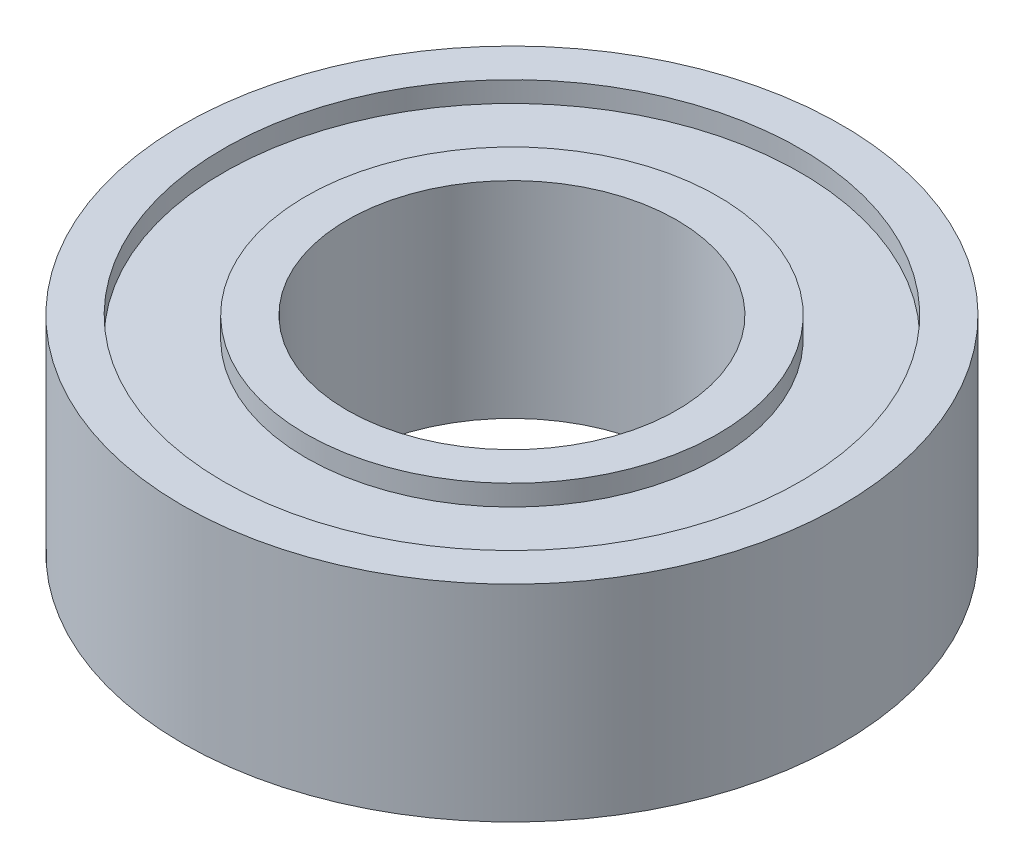
ISO-10303-21;
HEADER;
FILE_DESCRIPTION(('STEP AP214'),'2;1');
FILE_NAME('part.step','',(''),(''),'','','');
FILE_SCHEMA(('AUTOMOTIVE_DESIGN { 1 0 10303 214 1 1 1 1 }'));
ENDSEC;
DATA;
#1=APPLICATION_CONTEXT('core data for automotive mechanical design processes');
#2=APPLICATION_PROTOCOL_DEFINITION('international standard','automotive_design',2000,#1);
#3=PRODUCT_CONTEXT('',#1,'mechanical');
#4=PRODUCT('Part','Part','',(#3));
#5=PRODUCT_RELATED_PRODUCT_CATEGORY('part','',(#4));
#6=PRODUCT_DEFINITION_FORMATION('','',#4);
#7=PRODUCT_DEFINITION_CONTEXT('part definition',#1,'design');
#8=PRODUCT_DEFINITION('design','',#6,#7);
#9=PRODUCT_DEFINITION_SHAPE('','',#8);
#10=(LENGTH_UNIT() NAMED_UNIT(*) SI_UNIT(.MILLI.,.METRE.));
#11=(NAMED_UNIT(*) PLANE_ANGLE_UNIT() SI_UNIT($,.RADIAN.));
#12=(NAMED_UNIT(*) SI_UNIT($,.STERADIAN.) SOLID_ANGLE_UNIT());
#13=UNCERTAINTY_MEASURE_WITH_UNIT(LENGTH_MEASURE(1.E-05),#10,'distance_accuracy_value','');
#14=(GEOMETRIC_REPRESENTATION_CONTEXT(3) GLOBAL_UNCERTAINTY_ASSIGNED_CONTEXT((#13)) GLOBAL_UNIT_ASSIGNED_CONTEXT((#10,
#11,#12)) REPRESENTATION_CONTEXT('',''));
#15=CARTESIAN_POINT('',(0.,0.,0.));
#16=DIRECTION('',(0.,0.,1.));
#17=DIRECTION('',(1.,0.,0.));
#18=AXIS2_PLACEMENT_3D('',#15,#16,#17);
#19=CARTESIAN_POINT('',(0.,5.,0.));
#20=DIRECTION('',(0.,-1.,0.));
#21=DIRECTION('',(0.,0.,-1.));
#22=AXIS2_PLACEMENT_3D('',#19,#20,#21);
#23=CYLINDRICAL_SURFACE('',#22,7.);
#24=CARTESIAN_POINT('',(0.,0.,0.));
#25=DIRECTION('',(0.,1.,0.));
#26=DIRECTION('',(0.,0.,1.));
#27=AXIS2_PLACEMENT_3D('',#24,#25,#26);
#28=CIRCLE('',#27,7.);
#29=CARTESIAN_POINT('',(0.,0.,7.));
#30=VERTEX_POINT('',#29);
#31=EDGE_CURVE('E62',#30,#30,#28,.T.);
#32=ORIENTED_EDGE('',*,*,#31,.F.);
#33=EDGE_LOOP('',(#32));
#34=FACE_BOUND('',#33,.T.);
#35=CARTESIAN_POINT('',(0.,0.5,0.));
#36=DIRECTION('',(0.,1.,0.));
#37=DIRECTION('',(0.,0.,1.));
#38=AXIS2_PLACEMENT_3D('',#35,#36,#37);
#39=CIRCLE('',#38,7.);
#40=CARTESIAN_POINT('',(0.,0.5,7.));
#41=VERTEX_POINT('',#40);
#42=EDGE_CURVE('E95',#41,#41,#39,.T.);
#43=ORIENTED_EDGE('',*,*,#42,.T.);
#44=EDGE_LOOP('',(#43));
#45=FACE_BOUND('',#44,.T.);
#46=ADVANCED_FACE('F42',(#34,#45),#23,.F.);
#47=CARTESIAN_POINT('',(0.,4.5,0.));
#48=DIRECTION('',(0.,1.,0.));
#49=DIRECTION('',(0.,0.,1.));
#50=AXIS2_PLACEMENT_3D('',#47,#48,#49);
#51=CIRCLE('',#50,7.);
#52=CARTESIAN_POINT('',(0.,4.5,7.));
#53=VERTEX_POINT('',#52);
#54=EDGE_CURVE('E11',#53,#53,#51,.T.);
#55=ORIENTED_EDGE('',*,*,#54,.F.);
#56=EDGE_LOOP('',(#55));
#57=FACE_BOUND('',#56,.T.);
#58=CARTESIAN_POINT('',(0.,5.,0.));
#59=DIRECTION('',(0.,1.,0.));
#60=DIRECTION('',(0.,0.,1.));
#61=AXIS2_PLACEMENT_3D('',#58,#59,#60);
#62=CIRCLE('',#61,7.);
#63=CARTESIAN_POINT('',(0.,5.,7.));
#64=VERTEX_POINT('',#63);
#65=EDGE_CURVE('E53',#64,#64,#62,.T.);
#66=ORIENTED_EDGE('',*,*,#65,.T.);
#67=EDGE_LOOP('',(#66));
#68=FACE_BOUND('',#67,.T.);
#69=ADVANCED_FACE('F44',(#57,#68),#23,.F.);
#70=CARTESIAN_POINT('',(0.,5.,0.));
#71=DIRECTION('',(0.,-1.,0.));
#72=DIRECTION('',(0.,0.,-1.));
#73=AXIS2_PLACEMENT_3D('',#70,#71,#72);
#74=CYLINDRICAL_SURFACE('',#73,8.);
#75=CARTESIAN_POINT('',(0.,5.,0.));
#76=DIRECTION('',(0.,1.,0.));
#77=DIRECTION('',(0.,0.,1.));
#78=AXIS2_PLACEMENT_3D('',#75,#76,#77);
#79=CIRCLE('',#78,8.);
#80=CARTESIAN_POINT('',(0.,5.,8.));
#81=VERTEX_POINT('',#80);
#82=EDGE_CURVE('E49',#81,#81,#79,.T.);
#83=ORIENTED_EDGE('',*,*,#82,.F.);
#84=EDGE_LOOP('',(#83));
#85=FACE_BOUND('',#84,.T.);
#86=CARTESIAN_POINT('',(0.,0.,0.));
#87=DIRECTION('',(0.,1.,0.));
#88=DIRECTION('',(0.,0.,1.));
#89=AXIS2_PLACEMENT_3D('',#86,#87,#88);
#90=CIRCLE('',#89,8.);
#91=CARTESIAN_POINT('',(0.,0.,8.));
#92=VERTEX_POINT('',#91);
#93=EDGE_CURVE('E58',#92,#92,#90,.T.);
#94=ORIENTED_EDGE('',*,*,#93,.T.);
#95=EDGE_LOOP('',(#94));
#96=FACE_BOUND('',#95,.T.);
#97=ADVANCED_FACE('F68',(#85,#96),#74,.T.);
#98=CARTESIAN_POINT('',(0.,5.,0.));
#99=DIRECTION('',(0.,1.,0.));
#100=DIRECTION('',(0.,0.,1.));
#101=AXIS2_PLACEMENT_3D('',#98,#99,#100);
#102=PLANE('',#101);
#103=ORIENTED_EDGE('',*,*,#65,.F.);
#104=EDGE_LOOP('',(#103));
#105=FACE_BOUND('',#104,.T.);
#106=ORIENTED_EDGE('',*,*,#82,.T.);
#107=EDGE_LOOP('',(#106));
#108=FACE_BOUND('',#107,.T.);
#109=ADVANCED_FACE('F73',(#105,#108),#102,.T.);
#110=CARTESIAN_POINT('',(0.,0.,0.));
#111=DIRECTION('',(0.,1.,0.));
#112=DIRECTION('',(0.,0.,1.));
#113=AXIS2_PLACEMENT_3D('',#110,#111,#112);
#114=PLANE('',#113);
#115=ORIENTED_EDGE('',*,*,#31,.T.);
#116=EDGE_LOOP('',(#115));
#117=FACE_BOUND('',#116,.T.);
#118=ORIENTED_EDGE('',*,*,#93,.F.);
#119=EDGE_LOOP('',(#118));
#120=FACE_BOUND('',#119,.T.);
#121=ADVANCED_FACE('F70',(#117,#120),#114,.F.);
#122=CARTESIAN_POINT('',(0.,4.5,0.));
#123=DIRECTION('',(0.,1.,0.));
#124=DIRECTION('',(0.,0.,1.));
#125=AXIS2_PLACEMENT_3D('',#122,#123,#124);
#126=PLANE('',#125);
#127=CARTESIAN_POINT('',(0.,4.5,0.));
#128=DIRECTION('',(0.,1.,0.));
#129=DIRECTION('',(0.,0.,1.));
#130=AXIS2_PLACEMENT_3D('',#127,#128,#129);
#131=CIRCLE('',#130,5.);
#132=CARTESIAN_POINT('',(0.,4.5,5.));
#133=VERTEX_POINT('',#132);
#134=EDGE_CURVE('E64',#133,#133,#131,.T.);
#135=ORIENTED_EDGE('',*,*,#134,.F.);
#136=EDGE_LOOP('',(#135));
#137=FACE_BOUND('',#136,.T.);
#138=ORIENTED_EDGE('',*,*,#54,.T.);
#139=EDGE_LOOP('',(#138));
#140=FACE_BOUND('',#139,.T.);
#141=ADVANCED_FACE('F72',(#137,#140),#126,.T.);
#142=CARTESIAN_POINT('',(0.,0.5,0.));
#143=DIRECTION('',(0.,1.,0.));
#144=DIRECTION('',(0.,0.,1.));
#145=AXIS2_PLACEMENT_3D('',#142,#143,#144);
#146=PLANE('',#145);
#147=CARTESIAN_POINT('',(0.,0.5,0.));
#148=DIRECTION('',(0.,1.,0.));
#149=DIRECTION('',(0.,0.,1.));
#150=AXIS2_PLACEMENT_3D('',#147,#148,#149);
#151=CIRCLE('',#150,5.);
#152=CARTESIAN_POINT('',(0.,0.5,5.));
#153=VERTEX_POINT('',#152);
#154=EDGE_CURVE('E97',#153,#153,#151,.F.);
#155=ORIENTED_EDGE('',*,*,#154,.F.);
#156=EDGE_LOOP('',(#155));
#157=FACE_BOUND('',#156,.T.);
#158=ORIENTED_EDGE('',*,*,#42,.F.);
#159=EDGE_LOOP('',(#158));
#160=FACE_BOUND('',#159,.T.);
#161=ADVANCED_FACE('F80',(#157,#160),#146,.F.);
#162=CARTESIAN_POINT('',(0.,5.,0.));
#163=DIRECTION('',(0.,-1.,0.));
#164=DIRECTION('',(0.,0.,-1.));
#165=AXIS2_PLACEMENT_3D('',#162,#163,#164);
#166=CYLINDRICAL_SURFACE('',#165,5.);
#167=CARTESIAN_POINT('',(0.,0.,0.));
#168=DIRECTION('',(0.,1.,0.));
#169=DIRECTION('',(0.,0.,1.));
#170=AXIS2_PLACEMENT_3D('',#167,#168,#169);
#171=CIRCLE('',#170,5.);
#172=CARTESIAN_POINT('',(0.,0.,5.));
#173=VERTEX_POINT('',#172);
#174=EDGE_CURVE('E104',#173,#173,#171,.T.);
#175=ORIENTED_EDGE('',*,*,#174,.T.);
#176=EDGE_LOOP('',(#175));
#177=FACE_BOUND('',#176,.T.);
#178=ORIENTED_EDGE('',*,*,#154,.T.);
#179=EDGE_LOOP('',(#178));
#180=FACE_BOUND('',#179,.T.);
#181=ADVANCED_FACE('F130',(#177,#180),#166,.T.);
#182=CARTESIAN_POINT('',(0.,5.,0.));
#183=DIRECTION('',(0.,-1.,0.));
#184=DIRECTION('',(0.,0.,-1.));
#185=AXIS2_PLACEMENT_3D('',#182,#183,#184);
#186=CYLINDRICAL_SURFACE('',#185,4.);
#187=CARTESIAN_POINT('',(0.,5.,0.));
#188=DIRECTION('',(0.,1.,0.));
#189=DIRECTION('',(0.,0.,1.));
#190=AXIS2_PLACEMENT_3D('',#187,#188,#189);
#191=CIRCLE('',#190,4.);
#192=CARTESIAN_POINT('',(0.,5.,4.));
#193=VERTEX_POINT('',#192);
#194=EDGE_CURVE('E107',#193,#193,#191,.T.);
#195=ORIENTED_EDGE('',*,*,#194,.T.);
#196=EDGE_LOOP('',(#195));
#197=FACE_BOUND('',#196,.T.);
#198=CARTESIAN_POINT('',(0.,0.,0.));
#199=DIRECTION('',(0.,1.,0.));
#200=DIRECTION('',(0.,0.,1.));
#201=AXIS2_PLACEMENT_3D('',#198,#199,#200);
#202=CIRCLE('',#201,4.);
#203=CARTESIAN_POINT('',(0.,0.,4.));
#204=VERTEX_POINT('',#203);
#205=EDGE_CURVE('E108',#204,#204,#202,.T.);
#206=ORIENTED_EDGE('',*,*,#205,.F.);
#207=EDGE_LOOP('',(#206));
#208=FACE_BOUND('',#207,.T.);
#209=ADVANCED_FACE('F116',(#197,#208),#186,.F.);
#210=ORIENTED_EDGE('',*,*,#134,.T.);
#211=EDGE_LOOP('',(#210));
#212=FACE_BOUND('',#211,.T.);
#213=CARTESIAN_POINT('',(0.,5.,0.));
#214=DIRECTION('',(0.,1.,0.));
#215=DIRECTION('',(0.,0.,1.));
#216=AXIS2_PLACEMENT_3D('',#213,#214,#215);
#217=CIRCLE('',#216,5.);
#218=CARTESIAN_POINT('',(0.,5.,5.));
#219=VERTEX_POINT('',#218);
#220=EDGE_CURVE('E101',#219,#219,#217,.T.);
#221=ORIENTED_EDGE('',*,*,#220,.F.);
#222=EDGE_LOOP('',(#221));
#223=FACE_BOUND('',#222,.T.);
#224=ADVANCED_FACE('F123',(#212,#223),#166,.T.);
#225=CARTESIAN_POINT('',(0.,5.,0.));
#226=DIRECTION('',(0.,1.,0.));
#227=DIRECTION('',(0.,0.,1.));
#228=AXIS2_PLACEMENT_3D('',#225,#226,#227);
#229=PLANE('',#228);
#230=ORIENTED_EDGE('',*,*,#194,.F.);
#231=EDGE_LOOP('',(#230));
#232=FACE_BOUND('',#231,.T.);
#233=ORIENTED_EDGE('',*,*,#220,.T.);
#234=EDGE_LOOP('',(#233));
#235=FACE_BOUND('',#234,.T.);
#236=ADVANCED_FACE('F119',(#232,#235),#229,.T.);
#237=CARTESIAN_POINT('',(0.,0.,0.));
#238=DIRECTION('',(0.,1.,0.));
#239=DIRECTION('',(0.,0.,1.));
#240=AXIS2_PLACEMENT_3D('',#237,#238,#239);
#241=PLANE('',#240);
#242=ORIENTED_EDGE('',*,*,#205,.T.);
#243=EDGE_LOOP('',(#242));
#244=FACE_BOUND('',#243,.T.);
#245=ORIENTED_EDGE('',*,*,#174,.F.);
#246=EDGE_LOOP('',(#245));
#247=FACE_BOUND('',#246,.T.);
#248=ADVANCED_FACE('F122',(#244,#247),#241,.F.);
#249=CLOSED_SHELL('',(#46,#69,#97,#109,#121,#141,#161,#181,#209,#224,#236,#248));
#250=MANIFOLD_SOLID_BREP('B2',#249);
#251=ADVANCED_BREP_SHAPE_REPRESENTATION('',(#18,#250),#14);
#252=SHAPE_DEFINITION_REPRESENTATION(#9,#251);
ENDSEC;
END-ISO-10303-21;
